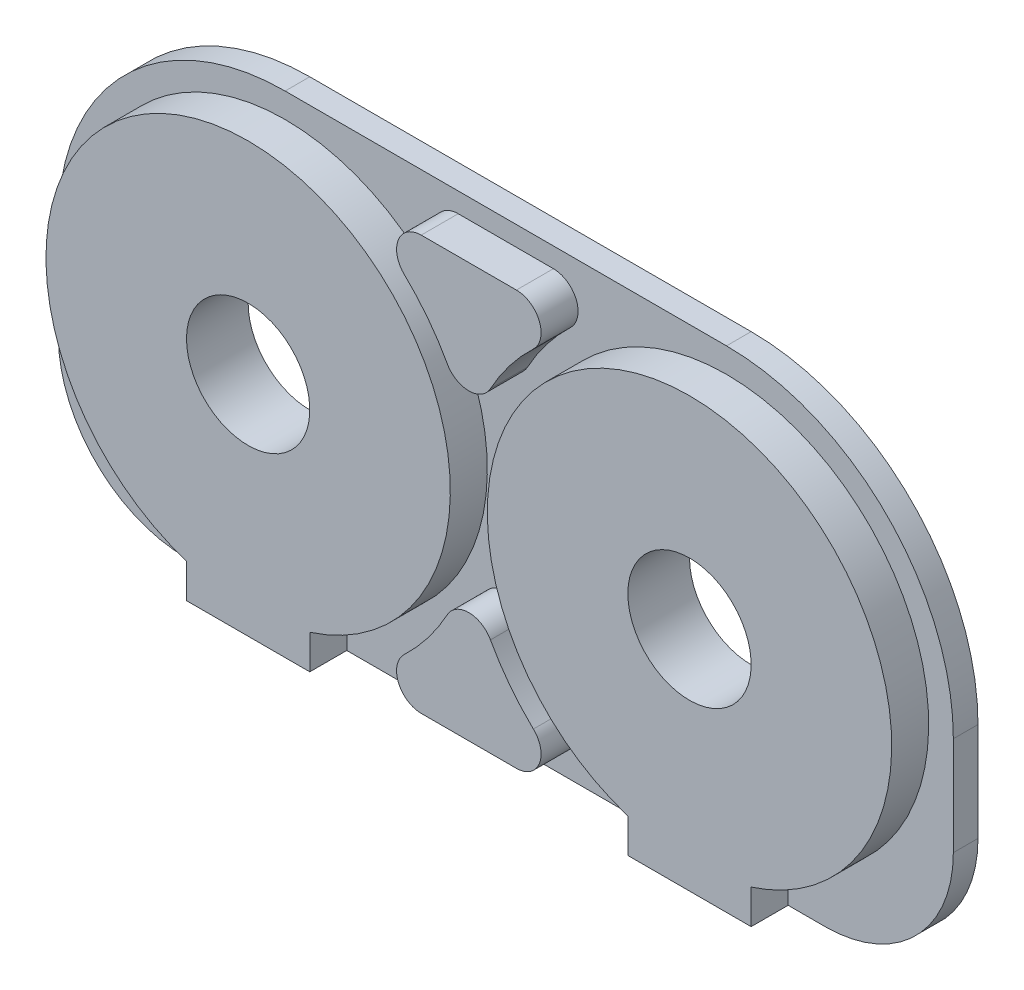
ISO-10303-21;
HEADER;
FILE_DESCRIPTION(('STEP AP214'),'2;1');
FILE_NAME('part.step','',(''),(''),'','','');
FILE_SCHEMA(('AUTOMOTIVE_DESIGN { 1 0 10303 214 1 1 1 1 }'));
ENDSEC;
DATA;
#1=APPLICATION_CONTEXT('core data for automotive mechanical design processes');
#2=APPLICATION_PROTOCOL_DEFINITION('international standard','automotive_design',2000,#1);
#3=PRODUCT_CONTEXT('',#1,'mechanical');
#4=PRODUCT('Part','Part','',(#3));
#5=PRODUCT_RELATED_PRODUCT_CATEGORY('part','',(#4));
#6=PRODUCT_DEFINITION_FORMATION('','',#4);
#7=PRODUCT_DEFINITION_CONTEXT('part definition',#1,'design');
#8=PRODUCT_DEFINITION('design','',#6,#7);
#9=PRODUCT_DEFINITION_SHAPE('','',#8);
#10=(LENGTH_UNIT() NAMED_UNIT(*) SI_UNIT(.MILLI.,.METRE.));
#11=(NAMED_UNIT(*) PLANE_ANGLE_UNIT() SI_UNIT($,.RADIAN.));
#12=(NAMED_UNIT(*) SI_UNIT($,.STERADIAN.) SOLID_ANGLE_UNIT());
#13=UNCERTAINTY_MEASURE_WITH_UNIT(LENGTH_MEASURE(1.E-05),#10,'distance_accuracy_value','');
#14=(GEOMETRIC_REPRESENTATION_CONTEXT(3) GLOBAL_UNCERTAINTY_ASSIGNED_CONTEXT((#13)) GLOBAL_UNIT_ASSIGNED_CONTEXT((#10,
#11,#12)) REPRESENTATION_CONTEXT('',''));
#15=CARTESIAN_POINT('',(0.,0.,0.));
#16=DIRECTION('',(0.,0.,1.));
#17=DIRECTION('',(1.,0.,0.));
#18=AXIS2_PLACEMENT_3D('',#15,#16,#17);
#19=CARTESIAN_POINT('',(8.95000000000006,0.,0.));
#20=DIRECTION('',(0.,0.,-1.));
#21=DIRECTION('',(-1.,0.,0.));
#22=AXIS2_PLACEMENT_3D('',#19,#20,#21);
#23=PLANE('',#22);
#24=CARTESIAN_POINT('',(-8.94999999999994,0.,0.));
#25=DIRECTION('',(0.,0.,-1.));
#26=DIRECTION('',(1.,0.,0.));
#27=AXIS2_PLACEMENT_3D('',#24,#25,#26);
#28=CIRCLE('',#27,9.2);
#29=CARTESIAN_POINT('',(-0.877450980392092,-4.41293012929374,0.));
#30=VERTEX_POINT('',#29);
#31=CARTESIAN_POINT('',(-2.61826099105817,-6.67450980392157,0.));
#32=VERTEX_POINT('',#31);
#33=EDGE_CURVE('E242',#30,#32,#28,.T.);
#34=ORIENTED_EDGE('',*,*,#33,.F.);
#35=CARTESIAN_POINT('',(0.,-4.89259644769523,0.));
#36=DIRECTION('',(0.,0.,1.));
#37=DIRECTION('',(1.,0.,0.));
#38=AXIS2_PLACEMENT_3D('',#35,#36,#37);
#39=CIRCLE('',#38,1.);
#40=CARTESIAN_POINT('',(0.877450980392217,-4.41293012929373,0.));
#41=VERTEX_POINT('',#40);
#42=EDGE_CURVE('E239',#41,#30,#39,.T.);
#43=ORIENTED_EDGE('',*,*,#42,.F.);
#44=CARTESIAN_POINT('',(8.95000000000006,0.,0.));
#45=DIRECTION('',(0.,0.,-1.));
#46=DIRECTION('',(1.,0.,0.));
#47=AXIS2_PLACEMENT_3D('',#44,#45,#46);
#48=CIRCLE('',#47,9.2);
#49=CARTESIAN_POINT('',(2.6182609910583,-6.67450980392157,0.));
#50=VERTEX_POINT('',#49);
#51=EDGE_CURVE('E910',#50,#41,#48,.T.);
#52=ORIENTED_EDGE('',*,*,#51,.F.);
#53=CARTESIAN_POINT('',(1.93002849008637,-7.4,0.));
#54=DIRECTION('',(0.,0.,1.));
#55=DIRECTION('',(1.,0.,0.));
#56=AXIS2_PLACEMENT_3D('',#53,#54,#55);
#57=CIRCLE('',#56,1.);
#58=CARTESIAN_POINT('',(1.93002849008637,-8.4,0.));
#59=VERTEX_POINT('',#58);
#60=EDGE_CURVE('E907',#59,#50,#57,.T.);
#61=ORIENTED_EDGE('',*,*,#60,.F.);
#62=DIRECTION('',(1.,0.,0.));
#63=VECTOR('',#62,1.);
#64=CARTESIAN_POINT('',(-1.93002849008624,-8.4,0.));
#65=LINE('',#64,#63);
#66=CARTESIAN_POINT('',(-1.93002849008624,-8.4,0.));
#67=VERTEX_POINT('',#66);
#68=EDGE_CURVE('E57',#67,#59,#65,.T.);
#69=ORIENTED_EDGE('',*,*,#68,.F.);
#70=CARTESIAN_POINT('',(-1.93002849008624,-7.4,0.));
#71=DIRECTION('',(0.,0.,1.));
#72=DIRECTION('',(1.,0.,0.));
#73=AXIS2_PLACEMENT_3D('',#70,#71,#72);
#74=CIRCLE('',#73,1.);
#75=EDGE_CURVE('E52',#32,#67,#74,.T.);
#76=ORIENTED_EDGE('',*,*,#75,.F.);
#77=EDGE_LOOP('',(#34,#43,#52,#61,#69,#76));
#78=FACE_BOUND('',#77,.T.);
#79=DIRECTION('',(0.,1.,0.));
#80=VECTOR('',#79,1.);
#81=CARTESIAN_POINT('',(-6.44999999999994,-8.01935159473632,0.));
#82=LINE('',#81,#80);
#83=CARTESIAN_POINT('',(-6.44999999999994,-9.2,0.));
#84=VERTEX_POINT('',#83);
#85=CARTESIAN_POINT('',(-6.44999999999994,-7.80960946526779,0.));
#86=VERTEX_POINT('',#85);
#87=EDGE_CURVE('E297',#84,#86,#82,.T.);
#88=ORIENTED_EDGE('',*,*,#87,.F.);
#89=DIRECTION('',(-1.,0.,0.));
#90=VECTOR('',#89,1.);
#91=CARTESIAN_POINT('',(-12.9499999999999,-9.2,0.));
#92=LINE('',#91,#90);
#93=CARTESIAN_POINT('',(6.45000000000006,-9.2,0.));
#94=VERTEX_POINT('',#93);
#95=EDGE_CURVE('E354',#94,#84,#92,.T.);
#96=ORIENTED_EDGE('',*,*,#95,.F.);
#97=DIRECTION('',(0.,-1.,0.));
#98=VECTOR('',#97,1.);
#99=CARTESIAN_POINT('',(6.45000000000006,-9.2,0.));
#100=LINE('',#99,#98);
#101=CARTESIAN_POINT('',(6.45000000000006,-7.80960946526776,0.));
#102=VERTEX_POINT('',#101);
#103=EDGE_CURVE('E398',#102,#94,#100,.T.);
#104=ORIENTED_EDGE('',*,*,#103,.F.);
#105=CARTESIAN_POINT('',(8.9500000000001,0.,0.));
#106=DIRECTION('',(0.,0.,1.));
#107=DIRECTION('',(1.,0.,0.));
#108=AXIS2_PLACEMENT_3D('',#105,#106,#107);
#109=CIRCLE('',#108,8.2);
#110=CARTESIAN_POINT('',(11.4500000000001,-7.80960946526779,0.));
#111=VERTEX_POINT('',#110);
#112=EDGE_CURVE('E384',#111,#102,#109,.T.);
#113=ORIENTED_EDGE('',*,*,#112,.F.);
#114=DIRECTION('',(0.,1.,0.));
#115=VECTOR('',#114,1.);
#116=CARTESIAN_POINT('',(11.4500000000001,-8.01935159473632,0.));
#117=LINE('',#116,#115);
#118=CARTESIAN_POINT('',(11.4500000000001,-9.2,0.));
#119=VERTEX_POINT('',#118);
#120=EDGE_CURVE('E389',#119,#111,#117,.T.);
#121=ORIENTED_EDGE('',*,*,#120,.F.);
#122=CARTESIAN_POINT('',(12.9500000000001,-9.2,0.));
#123=VERTEX_POINT('',#122);
#124=EDGE_CURVE('E350',#123,#119,#92,.T.);
#125=ORIENTED_EDGE('',*,*,#124,.F.);
#126=CARTESIAN_POINT('',(12.9500000000001,-4.,0.));
#127=DIRECTION('',(0.,0.,-1.));
#128=DIRECTION('',(-1.,0.,0.));
#129=AXIS2_PLACEMENT_3D('',#126,#127,#128);
#130=CIRCLE('',#129,5.2);
#131=CARTESIAN_POINT('',(18.1500000000001,-4.,0.));
#132=VERTEX_POINT('',#131);
#133=EDGE_CURVE('E346',#132,#123,#130,.T.);
#134=ORIENTED_EDGE('',*,*,#133,.F.);
#135=DIRECTION('',(0.,-1.,0.));
#136=VECTOR('',#135,1.);
#137=CARTESIAN_POINT('',(18.1500000000001,-4.,0.));
#138=LINE('',#137,#136);
#139=CARTESIAN_POINT('',(18.1500000000001,0.,0.));
#140=VERTEX_POINT('',#139);
#141=EDGE_CURVE('E344',#140,#132,#138,.T.);
#142=ORIENTED_EDGE('',*,*,#141,.F.);
#143=CARTESIAN_POINT('',(8.95000000000006,0.,0.));
#144=DIRECTION('',(0.,0.,-1.));
#145=DIRECTION('',(-1.,0.,0.));
#146=AXIS2_PLACEMENT_3D('',#143,#144,#145);
#147=CIRCLE('',#146,9.2);
#148=CARTESIAN_POINT('',(8.95000000000006,9.2,0.));
#149=VERTEX_POINT('',#148);
#150=EDGE_CURVE('E322',#149,#140,#147,.T.);
#151=ORIENTED_EDGE('',*,*,#150,.F.);
#152=DIRECTION('',(1.,0.,0.));
#153=VECTOR('',#152,1.);
#154=CARTESIAN_POINT('',(8.95000000000006,9.2,0.));
#155=LINE('',#154,#153);
#156=CARTESIAN_POINT('',(-8.94999999999994,9.2,0.));
#157=VERTEX_POINT('',#156);
#158=EDGE_CURVE('E327',#157,#149,#155,.T.);
#159=ORIENTED_EDGE('',*,*,#158,.F.);
#160=CARTESIAN_POINT('',(-8.94999999999994,0.,0.));
#161=DIRECTION('',(0.,0.,-1.));
#162=DIRECTION('',(-1.,0.,0.));
#163=AXIS2_PLACEMENT_3D('',#160,#161,#162);
#164=CIRCLE('',#163,9.2);
#165=CARTESIAN_POINT('',(-18.1499999999999,0.,0.));
#166=VERTEX_POINT('',#165);
#167=EDGE_CURVE('E358',#166,#157,#164,.T.);
#168=ORIENTED_EDGE('',*,*,#167,.F.);
#169=DIRECTION('',(0.,1.,0.));
#170=VECTOR('',#169,1.);
#171=CARTESIAN_POINT('',(-18.1499999999999,0.,0.));
#172=LINE('',#171,#170);
#173=CARTESIAN_POINT('',(-18.1499999999999,-4.,0.));
#174=VERTEX_POINT('',#173);
#175=EDGE_CURVE('E356',#174,#166,#172,.T.);
#176=ORIENTED_EDGE('',*,*,#175,.F.);
#177=CARTESIAN_POINT('',(-12.9499999999999,-4.,0.));
#178=DIRECTION('',(0.,0.,-1.));
#179=DIRECTION('',(-1.,0.,0.));
#180=AXIS2_PLACEMENT_3D('',#177,#178,#179);
#181=CIRCLE('',#180,5.2);
#182=CARTESIAN_POINT('',(-12.9499999999999,-9.2,0.));
#183=VERTEX_POINT('',#182);
#184=EDGE_CURVE('E353',#183,#174,#181,.T.);
#185=ORIENTED_EDGE('',*,*,#184,.F.);
#186=CARTESIAN_POINT('',(-11.4499999999999,-9.2,0.));
#187=VERTEX_POINT('',#186);
#188=EDGE_CURVE('E349',#187,#183,#92,.T.);
#189=ORIENTED_EDGE('',*,*,#188,.F.);
#190=DIRECTION('',(0.,-1.,0.));
#191=VECTOR('',#190,1.);
#192=CARTESIAN_POINT('',(-11.4499999999999,-9.2,0.));
#193=LINE('',#192,#191);
#194=CARTESIAN_POINT('',(-11.4499999999999,-7.80960946526776,0.));
#195=VERTEX_POINT('',#194);
#196=EDGE_CURVE('E301',#195,#187,#193,.T.);
#197=ORIENTED_EDGE('',*,*,#196,.F.);
#198=CARTESIAN_POINT('',(-8.9499999999999,0.,0.));
#199=DIRECTION('',(0.,0.,1.));
#200=DIRECTION('',(1.,0.,0.));
#201=AXIS2_PLACEMENT_3D('',#198,#199,#200);
#202=CIRCLE('',#201,8.2);
#203=EDGE_CURVE('E309',#86,#195,#202,.T.);
#204=ORIENTED_EDGE('',*,*,#203,.F.);
#205=EDGE_LOOP('',(#88,#96,#104,#113,#121,#125,#134,#142,#151,#159,#168,#176,#185,#189,#197,#204));
#206=FACE_BOUND('',#205,.T.);
#207=CARTESIAN_POINT('',(-1.93002849008624,7.4,0.));
#208=DIRECTION('',(0.,0.,1.));
#209=DIRECTION('',(1.,0.,0.));
#210=AXIS2_PLACEMENT_3D('',#207,#208,#209);
#211=CIRCLE('',#210,1.);
#212=CARTESIAN_POINT('',(-1.93002849008624,8.4,0.));
#213=VERTEX_POINT('',#212);
#214=CARTESIAN_POINT('',(-2.61826099105817,6.67450980392157,0.));
#215=VERTEX_POINT('',#214);
#216=EDGE_CURVE('E243',#213,#215,#211,.T.);
#217=ORIENTED_EDGE('',*,*,#216,.F.);
#218=DIRECTION('',(-1.,0.,0.));
#219=VECTOR('',#218,1.);
#220=CARTESIAN_POINT('',(1.93002849008637,8.4,0.));
#221=LINE('',#220,#219);
#222=CARTESIAN_POINT('',(1.93002849008637,8.4,0.));
#223=VERTEX_POINT('',#222);
#224=EDGE_CURVE('E256',#223,#213,#221,.T.);
#225=ORIENTED_EDGE('',*,*,#224,.F.);
#226=CARTESIAN_POINT('',(1.93002849008637,7.4,0.));
#227=DIRECTION('',(0.,0.,1.));
#228=DIRECTION('',(1.,0.,0.));
#229=AXIS2_PLACEMENT_3D('',#226,#227,#228);
#230=CIRCLE('',#229,1.);
#231=CARTESIAN_POINT('',(2.6182609910583,6.67450980392157,0.));
#232=VERTEX_POINT('',#231);
#233=EDGE_CURVE('E275',#232,#223,#230,.T.);
#234=ORIENTED_EDGE('',*,*,#233,.F.);
#235=CARTESIAN_POINT('',(8.95000000000006,0.,0.));
#236=DIRECTION('',(0.,0.,-1.));
#237=DIRECTION('',(1.,0.,0.));
#238=AXIS2_PLACEMENT_3D('',#235,#236,#237);
#239=CIRCLE('',#238,9.2);
#240=CARTESIAN_POINT('',(0.877450980392222,4.41293012929374,0.));
#241=VERTEX_POINT('',#240);
#242=EDGE_CURVE('E272',#241,#232,#239,.T.);
#243=ORIENTED_EDGE('',*,*,#242,.F.);
#244=CARTESIAN_POINT('',(0.,4.89259644769523,0.));
#245=DIRECTION('',(0.,0.,1.));
#246=DIRECTION('',(1.,0.,0.));
#247=AXIS2_PLACEMENT_3D('',#244,#245,#246);
#248=CIRCLE('',#247,1.);
#249=CARTESIAN_POINT('',(-0.877450980392092,4.41293012929374,0.));
#250=VERTEX_POINT('',#249);
#251=EDGE_CURVE('E269',#250,#241,#248,.T.);
#252=ORIENTED_EDGE('',*,*,#251,.F.);
#253=CARTESIAN_POINT('',(-8.94999999999994,0.,0.));
#254=DIRECTION('',(0.,0.,-1.));
#255=DIRECTION('',(1.,0.,0.));
#256=AXIS2_PLACEMENT_3D('',#253,#254,#255);
#257=CIRCLE('',#256,9.2);
#258=EDGE_CURVE('E246',#215,#250,#257,.T.);
#259=ORIENTED_EDGE('',*,*,#258,.F.);
#260=EDGE_LOOP('',(#217,#225,#234,#243,#252,#259));
#261=FACE_BOUND('',#260,.T.);
#262=ADVANCED_FACE('F37',(#78,#206,#261),#23,.F.);
#263=CARTESIAN_POINT('',(8.9500000000001,0.,1.5));
#264=DIRECTION('',(0.,0.,-1.));
#265=DIRECTION('',(-1.,0.,0.));
#266=AXIS2_PLACEMENT_3D('',#263,#264,#265);
#267=CYLINDRICAL_SURFACE('',#266,8.2);
#268=ORIENTED_EDGE('',*,*,#112,.T.);
#269=DIRECTION('',(0.,0.,-1.));
#270=VECTOR('',#269,1.);
#271=CARTESIAN_POINT('',(6.45000000000006,-7.80960946526776,1.5));
#272=LINE('',#271,#270);
#273=CARTESIAN_POINT('',(6.45000000000006,-7.80960946526776,1.5));
#274=VERTEX_POINT('',#273);
#275=EDGE_CURVE('E11',#274,#102,#272,.T.);
#276=ORIENTED_EDGE('',*,*,#275,.F.);
#277=CARTESIAN_POINT('',(8.9500000000001,0.,1.5));
#278=DIRECTION('',(0.,0.,1.));
#279=DIRECTION('',(1.,0.,0.));
#280=AXIS2_PLACEMENT_3D('',#277,#278,#279);
#281=CIRCLE('',#280,8.2);
#282=CARTESIAN_POINT('',(11.4500000000001,-7.80960946526779,1.5));
#283=VERTEX_POINT('',#282);
#284=EDGE_CURVE('E385',#283,#274,#281,.T.);
#285=ORIENTED_EDGE('',*,*,#284,.F.);
#286=DIRECTION('',(0.,0.,-1.));
#287=VECTOR('',#286,1.);
#288=CARTESIAN_POINT('',(11.4500000000001,-7.80960946526779,1.5));
#289=LINE('',#288,#287);
#290=EDGE_CURVE('E395',#283,#111,#289,.T.);
#291=ORIENTED_EDGE('',*,*,#290,.T.);
#292=EDGE_LOOP('',(#268,#276,#285,#291));
#293=FACE_BOUND('',#292,.T.);
#294=ADVANCED_FACE('F39',(#293),#267,.T.);
#295=CARTESIAN_POINT('',(6.45000000000006,-9.2,1.5));
#296=DIRECTION('',(1.,0.,0.));
#297=DIRECTION('',(0.,0.,-1.));
#298=AXIS2_PLACEMENT_3D('',#295,#296,#297);
#299=PLANE('',#298);
#300=ORIENTED_EDGE('',*,*,#103,.T.);
#301=DIRECTION('',(0.,0.,-1.));
#302=VECTOR('',#301,1.);
#303=CARTESIAN_POINT('',(6.45000000000006,-9.2,1.5));
#304=LINE('',#303,#302);
#305=CARTESIAN_POINT('',(6.45000000000006,-9.2,1.5));
#306=VERTEX_POINT('',#305);
#307=EDGE_CURVE('E45',#306,#94,#304,.T.);
#308=ORIENTED_EDGE('',*,*,#307,.F.);
#309=DIRECTION('',(0.,-1.,0.));
#310=VECTOR('',#309,1.);
#311=CARTESIAN_POINT('',(6.45000000000006,-8.01935159473632,1.5));
#312=LINE('',#311,#310);
#313=EDGE_CURVE('E388',#274,#306,#312,.T.);
#314=ORIENTED_EDGE('',*,*,#313,.F.);
#315=ORIENTED_EDGE('',*,*,#275,.T.);
#316=EDGE_LOOP('',(#300,#308,#314,#315));
#317=FACE_BOUND('',#316,.T.);
#318=ADVANCED_FACE('F416',(#317),#299,.F.);
#319=CARTESIAN_POINT('',(11.4500000000001,-9.2,1.5));
#320=DIRECTION('',(0.,1.,0.));
#321=DIRECTION('',(0.,0.,1.));
#322=AXIS2_PLACEMENT_3D('',#319,#320,#321);
#323=PLANE('',#322);
#324=ORIENTED_EDGE('',*,*,#307,.T.);
#325=ORIENTED_EDGE('',*,*,#95,.T.);
#326=DIRECTION('',(0.,0.,-1.));
#327=VECTOR('',#326,1.);
#328=CARTESIAN_POINT('',(-6.44999999999994,-9.2,1.5));
#329=LINE('',#328,#327);
#330=CARTESIAN_POINT('',(-6.44999999999994,-9.2,1.5));
#331=VERTEX_POINT('',#330);
#332=EDGE_CURVE('E307',#331,#84,#329,.T.);
#333=ORIENTED_EDGE('',*,*,#332,.F.);
#334=DIRECTION('',(1.,0.,0.));
#335=VECTOR('',#334,1.);
#336=CARTESIAN_POINT('',(-6.44999999999994,-9.2,1.5));
#337=LINE('',#336,#335);
#338=CARTESIAN_POINT('',(-11.4499999999999,-9.2,1.5));
#339=VERTEX_POINT('',#338);
#340=EDGE_CURVE('E305',#339,#331,#337,.T.);
#341=ORIENTED_EDGE('',*,*,#340,.F.);
#342=DIRECTION('',(0.,0.,-1.));
#343=VECTOR('',#342,1.);
#344=CARTESIAN_POINT('',(-11.4499999999999,-9.2,1.5));
#345=LINE('',#344,#343);
#346=EDGE_CURVE('E314',#339,#187,#345,.T.);
#347=ORIENTED_EDGE('',*,*,#346,.T.);
#348=ORIENTED_EDGE('',*,*,#188,.T.);
#349=DIRECTION('',(0.,0.,1.));
#350=VECTOR('',#349,1.);
#351=CARTESIAN_POINT('',(-12.9499999999999,-9.2,-1.));
#352=LINE('',#351,#350);
#353=CARTESIAN_POINT('',(-12.9499999999999,-9.2,-1.));
#354=VERTEX_POINT('',#353);
#355=EDGE_CURVE('E372',#354,#183,#352,.T.);
#356=ORIENTED_EDGE('',*,*,#355,.F.);
#357=DIRECTION('',(-1.,0.,0.));
#358=VECTOR('',#357,1.);
#359=CARTESIAN_POINT('',(11.4500000000001,-9.2,-1.));
#360=LINE('',#359,#358);
#361=CARTESIAN_POINT('',(12.9500000000001,-9.2,-1.));
#362=VERTEX_POINT('',#361);
#363=EDGE_CURVE('E331',#362,#354,#360,.T.);
#364=ORIENTED_EDGE('',*,*,#363,.F.);
#365=DIRECTION('',(0.,0.,1.));
#366=VECTOR('',#365,1.);
#367=CARTESIAN_POINT('',(12.9500000000001,-9.2,-1.));
#368=LINE('',#367,#366);
#369=EDGE_CURVE('E375',#362,#123,#368,.T.);
#370=ORIENTED_EDGE('',*,*,#369,.T.);
#371=ORIENTED_EDGE('',*,*,#124,.T.);
#372=DIRECTION('',(0.,0.,-1.));
#373=VECTOR('',#372,1.);
#374=CARTESIAN_POINT('',(11.4500000000001,-9.2,1.5));
#375=LINE('',#374,#373);
#376=CARTESIAN_POINT('',(11.4500000000001,-9.2,1.5));
#377=VERTEX_POINT('',#376);
#378=EDGE_CURVE('E405',#377,#119,#375,.T.);
#379=ORIENTED_EDGE('',*,*,#378,.F.);
#380=DIRECTION('',(1.,0.,0.));
#381=VECTOR('',#380,1.);
#382=CARTESIAN_POINT('',(11.4500000000001,-9.2,1.5));
#383=LINE('',#382,#381);
#384=EDGE_CURVE('E391',#306,#377,#383,.T.);
#385=ORIENTED_EDGE('',*,*,#384,.F.);
#386=EDGE_LOOP('',(#324,#325,#333,#341,#347,#348,#356,#364,#370,#371,#379,#385));
#387=FACE_BOUND('',#386,.T.);
#388=ADVANCED_FACE('F412',(#387),#323,.F.);
#389=CARTESIAN_POINT('',(11.4500000000001,-8.01935159473632,1.5));
#390=DIRECTION('',(-1.,0.,0.));
#391=DIRECTION('',(0.,0.,1.));
#392=AXIS2_PLACEMENT_3D('',#389,#390,#391);
#393=PLANE('',#392);
#394=ORIENTED_EDGE('',*,*,#120,.T.);
#395=ORIENTED_EDGE('',*,*,#290,.F.);
#396=DIRECTION('',(0.,1.,0.));
#397=VECTOR('',#396,1.);
#398=CARTESIAN_POINT('',(11.4500000000001,-8.01935159473632,1.5));
#399=LINE('',#398,#397);
#400=EDGE_CURVE('E393',#377,#283,#399,.T.);
#401=ORIENTED_EDGE('',*,*,#400,.F.);
#402=ORIENTED_EDGE('',*,*,#378,.T.);
#403=EDGE_LOOP('',(#394,#395,#401,#402));
#404=FACE_BOUND('',#403,.T.);
#405=ADVANCED_FACE('F457',(#404),#393,.F.);
#406=CARTESIAN_POINT('',(8.9500000000001,0.,1.5));
#407=DIRECTION('',(0.,0.,1.));
#408=DIRECTION('',(1.,0.,0.));
#409=AXIS2_PLACEMENT_3D('',#406,#407,#408);
#410=PLANE('',#409);
#411=CARTESIAN_POINT('',(8.94999999999993,0.,1.5));
#412=DIRECTION('',(0.,0.,-1.));
#413=DIRECTION('',(-1.,0.,0.));
#414=AXIS2_PLACEMENT_3D('',#411,#412,#413);
#415=CIRCLE('',#414,2.5);
#416=CARTESIAN_POINT('',(6.44999999999993,0.,1.5));
#417=VERTEX_POINT('',#416);
#418=EDGE_CURVE('E884',#417,#417,#415,.T.);
#419=ORIENTED_EDGE('',*,*,#418,.T.);
#420=EDGE_LOOP('',(#419));
#421=FACE_BOUND('',#420,.T.);
#422=ORIENTED_EDGE('',*,*,#284,.T.);
#423=ORIENTED_EDGE('',*,*,#313,.T.);
#424=ORIENTED_EDGE('',*,*,#384,.T.);
#425=ORIENTED_EDGE('',*,*,#400,.T.);
#426=EDGE_LOOP('',(#422,#423,#424,#425));
#427=FACE_BOUND('',#426,.T.);
#428=ADVANCED_FACE('F462',(#421,#427),#410,.T.);
#429=CARTESIAN_POINT('',(8.95000000000006,0.,-1.));
#430=DIRECTION('',(0.,0.,1.));
#431=DIRECTION('',(1.,0.,0.));
#432=AXIS2_PLACEMENT_3D('',#429,#430,#431);
#433=CYLINDRICAL_SURFACE('',#432,9.2);
#434=ORIENTED_EDGE('',*,*,#150,.T.);
#435=DIRECTION('',(0.,0.,1.));
#436=VECTOR('',#435,1.);
#437=CARTESIAN_POINT('',(18.1500000000001,0.,-1.));
#438=LINE('',#437,#436);
#439=CARTESIAN_POINT('',(18.1500000000001,0.,-1.));
#440=VERTEX_POINT('',#439);
#441=EDGE_CURVE('E381',#440,#140,#438,.T.);
#442=ORIENTED_EDGE('',*,*,#441,.F.);
#443=CARTESIAN_POINT('',(8.95000000000006,0.,-1.));
#444=DIRECTION('',(0.,0.,-1.));
#445=DIRECTION('',(-1.,0.,0.));
#446=AXIS2_PLACEMENT_3D('',#443,#444,#445);
#447=CIRCLE('',#446,9.2);
#448=CARTESIAN_POINT('',(8.95000000000006,9.2,-1.));
#449=VERTEX_POINT('',#448);
#450=EDGE_CURVE('E323',#449,#440,#447,.T.);
#451=ORIENTED_EDGE('',*,*,#450,.F.);
#452=DIRECTION('',(0.,0.,1.));
#453=VECTOR('',#452,1.);
#454=CARTESIAN_POINT('',(8.95000000000006,9.2,-1.));
#455=LINE('',#454,#453);
#456=EDGE_CURVE('E341',#449,#149,#455,.T.);
#457=ORIENTED_EDGE('',*,*,#456,.T.);
#458=EDGE_LOOP('',(#434,#442,#451,#457));
#459=FACE_BOUND('',#458,.T.);
#460=ADVANCED_FACE('F464',(#459),#433,.T.);
#461=CARTESIAN_POINT('',(18.1500000000001,-4.,-1.));
#462=DIRECTION('',(-1.,0.,0.));
#463=DIRECTION('',(0.,0.,1.));
#464=AXIS2_PLACEMENT_3D('',#461,#462,#463);
#465=PLANE('',#464);
#466=ORIENTED_EDGE('',*,*,#141,.T.);
#467=DIRECTION('',(0.,0.,1.));
#468=VECTOR('',#467,1.);
#469=CARTESIAN_POINT('',(18.1500000000001,-4.,-1.));
#470=LINE('',#469,#468);
#471=CARTESIAN_POINT('',(18.1500000000001,-4.,-1.));
#472=VERTEX_POINT('',#471);
#473=EDGE_CURVE('E378',#472,#132,#470,.T.);
#474=ORIENTED_EDGE('',*,*,#473,.F.);
#475=DIRECTION('',(0.,-1.,0.));
#476=VECTOR('',#475,1.);
#477=CARTESIAN_POINT('',(18.1500000000001,-4.,-1.));
#478=LINE('',#477,#476);
#479=EDGE_CURVE('E326',#440,#472,#478,.T.);
#480=ORIENTED_EDGE('',*,*,#479,.F.);
#481=ORIENTED_EDGE('',*,*,#441,.T.);
#482=EDGE_LOOP('',(#466,#474,#480,#481));
#483=FACE_BOUND('',#482,.T.);
#484=ADVANCED_FACE('F471',(#483),#465,.F.);
#485=CARTESIAN_POINT('',(12.9500000000001,-4.,-1.));
#486=DIRECTION('',(0.,0.,1.));
#487=DIRECTION('',(1.,0.,0.));
#488=AXIS2_PLACEMENT_3D('',#485,#486,#487);
#489=CYLINDRICAL_SURFACE('',#488,5.2);
#490=ORIENTED_EDGE('',*,*,#133,.T.);
#491=ORIENTED_EDGE('',*,*,#369,.F.);
#492=CARTESIAN_POINT('',(12.9500000000001,-4.,-1.));
#493=DIRECTION('',(0.,0.,-1.));
#494=DIRECTION('',(-1.,0.,0.));
#495=AXIS2_PLACEMENT_3D('',#492,#493,#494);
#496=CIRCLE('',#495,5.2);
#497=EDGE_CURVE('E329',#472,#362,#496,.T.);
#498=ORIENTED_EDGE('',*,*,#497,.F.);
#499=ORIENTED_EDGE('',*,*,#473,.T.);
#500=EDGE_LOOP('',(#490,#491,#498,#499));
#501=FACE_BOUND('',#500,.T.);
#502=ADVANCED_FACE('F451',(#501),#489,.T.);
#503=CARTESIAN_POINT('',(-12.9499999999999,-4.,-1.));
#504=DIRECTION('',(0.,0.,1.));
#505=DIRECTION('',(1.,0.,0.));
#506=AXIS2_PLACEMENT_3D('',#503,#504,#505);
#507=CYLINDRICAL_SURFACE('',#506,5.2);
#508=ORIENTED_EDGE('',*,*,#184,.T.);
#509=DIRECTION('',(0.,0.,1.));
#510=VECTOR('',#509,1.);
#511=CARTESIAN_POINT('',(-18.1499999999999,-4.,-1.));
#512=LINE('',#511,#510);
#513=CARTESIAN_POINT('',(-18.1499999999999,-4.,-1.));
#514=VERTEX_POINT('',#513);
#515=EDGE_CURVE('E369',#514,#174,#512,.T.);
#516=ORIENTED_EDGE('',*,*,#515,.F.);
#517=CARTESIAN_POINT('',(-12.9499999999999,-4.,-1.));
#518=DIRECTION('',(0.,0.,-1.));
#519=DIRECTION('',(-1.,0.,0.));
#520=AXIS2_PLACEMENT_3D('',#517,#518,#519);
#521=CIRCLE('',#520,5.2);
#522=EDGE_CURVE('E333',#354,#514,#521,.T.);
#523=ORIENTED_EDGE('',*,*,#522,.F.);
#524=ORIENTED_EDGE('',*,*,#355,.T.);
#525=EDGE_LOOP('',(#508,#516,#523,#524));
#526=FACE_BOUND('',#525,.T.);
#527=ADVANCED_FACE('F431',(#526),#507,.T.);
#528=CARTESIAN_POINT('',(-18.1499999999999,0.,-1.));
#529=DIRECTION('',(1.,0.,0.));
#530=DIRECTION('',(0.,1.,0.));
#531=AXIS2_PLACEMENT_3D('',#528,#529,#530);
#532=PLANE('',#531);
#533=ORIENTED_EDGE('',*,*,#175,.T.);
#534=DIRECTION('',(0.,0.,1.));
#535=VECTOR('',#534,1.);
#536=CARTESIAN_POINT('',(-18.1499999999999,0.,-1.));
#537=LINE('',#536,#535);
#538=CARTESIAN_POINT('',(-18.1499999999999,0.,-1.));
#539=VERTEX_POINT('',#538);
#540=EDGE_CURVE('E366',#539,#166,#537,.T.);
#541=ORIENTED_EDGE('',*,*,#540,.F.);
#542=DIRECTION('',(0.,1.,0.));
#543=VECTOR('',#542,1.);
#544=CARTESIAN_POINT('',(-18.1499999999999,0.,-1.));
#545=LINE('',#544,#543);
#546=EDGE_CURVE('E335',#514,#539,#545,.T.);
#547=ORIENTED_EDGE('',*,*,#546,.F.);
#548=ORIENTED_EDGE('',*,*,#515,.T.);
#549=EDGE_LOOP('',(#533,#541,#547,#548));
#550=FACE_BOUND('',#549,.T.);
#551=ADVANCED_FACE('F438',(#550),#532,.F.);
#552=CARTESIAN_POINT('',(-8.94999999999994,0.,-1.));
#553=DIRECTION('',(0.,0.,1.));
#554=DIRECTION('',(1.,0.,0.));
#555=AXIS2_PLACEMENT_3D('',#552,#553,#554);
#556=CYLINDRICAL_SURFACE('',#555,9.2);
#557=ORIENTED_EDGE('',*,*,#167,.T.);
#558=DIRECTION('',(0.,0.,1.));
#559=VECTOR('',#558,1.);
#560=CARTESIAN_POINT('',(-8.94999999999994,9.2,-1.));
#561=LINE('',#560,#559);
#562=CARTESIAN_POINT('',(-8.94999999999994,9.2,-1.));
#563=VERTEX_POINT('',#562);
#564=EDGE_CURVE('E363',#563,#157,#561,.T.);
#565=ORIENTED_EDGE('',*,*,#564,.F.);
#566=CARTESIAN_POINT('',(-8.94999999999994,0.,-1.));
#567=DIRECTION('',(0.,0.,-1.));
#568=DIRECTION('',(-1.,0.,0.));
#569=AXIS2_PLACEMENT_3D('',#566,#567,#568);
#570=CIRCLE('',#569,9.2);
#571=EDGE_CURVE('E337',#539,#563,#570,.T.);
#572=ORIENTED_EDGE('',*,*,#571,.F.);
#573=ORIENTED_EDGE('',*,*,#540,.T.);
#574=EDGE_LOOP('',(#557,#565,#572,#573));
#575=FACE_BOUND('',#574,.T.);
#576=ADVANCED_FACE('F442',(#575),#556,.T.);
#577=CARTESIAN_POINT('',(8.95000000000006,9.2,-1.));
#578=DIRECTION('',(0.,-1.,0.));
#579=DIRECTION('',(0.,0.,-1.));
#580=AXIS2_PLACEMENT_3D('',#577,#578,#579);
#581=PLANE('',#580);
#582=ORIENTED_EDGE('',*,*,#158,.T.);
#583=ORIENTED_EDGE('',*,*,#456,.F.);
#584=DIRECTION('',(1.,0.,0.));
#585=VECTOR('',#584,1.);
#586=CARTESIAN_POINT('',(8.95000000000006,9.2,-1.));
#587=LINE('',#586,#585);
#588=EDGE_CURVE('E339',#563,#449,#587,.T.);
#589=ORIENTED_EDGE('',*,*,#588,.F.);
#590=ORIENTED_EDGE('',*,*,#564,.T.);
#591=EDGE_LOOP('',(#582,#583,#589,#590));
#592=FACE_BOUND('',#591,.T.);
#593=ADVANCED_FACE('F484',(#592),#581,.F.);
#594=CARTESIAN_POINT('',(8.95000000000006,0.,-1.));
#595=DIRECTION('',(0.,0.,-1.));
#596=DIRECTION('',(-1.,0.,0.));
#597=AXIS2_PLACEMENT_3D('',#594,#595,#596);
#598=PLANE('',#597);
#599=CARTESIAN_POINT('',(8.94999999999993,0.,-1.));
#600=DIRECTION('',(0.,0.,-1.));
#601=DIRECTION('',(-1.,0.,0.));
#602=AXIS2_PLACEMENT_3D('',#599,#600,#601);
#603=CIRCLE('',#602,2.5);
#604=CARTESIAN_POINT('',(6.44999999999993,0.,-1.));
#605=VERTEX_POINT('',#604);
#606=EDGE_CURVE('E887',#605,#605,#603,.T.);
#607=ORIENTED_EDGE('',*,*,#606,.F.);
#608=EDGE_LOOP('',(#607));
#609=FACE_BOUND('',#608,.T.);
#610=CARTESIAN_POINT('',(-8.95000000000007,0.,-1.));
#611=DIRECTION('',(0.,0.,-1.));
#612=DIRECTION('',(-1.,0.,0.));
#613=AXIS2_PLACEMENT_3D('',#610,#611,#612);
#614=CIRCLE('',#613,2.5);
#615=CARTESIAN_POINT('',(-11.4500000000001,0.,-1.));
#616=VERTEX_POINT('',#615);
#617=EDGE_CURVE('E892',#616,#616,#614,.T.);
#618=ORIENTED_EDGE('',*,*,#617,.F.);
#619=EDGE_LOOP('',(#618));
#620=FACE_BOUND('',#619,.T.);
#621=ORIENTED_EDGE('',*,*,#450,.T.);
#622=ORIENTED_EDGE('',*,*,#479,.T.);
#623=ORIENTED_EDGE('',*,*,#497,.T.);
#624=ORIENTED_EDGE('',*,*,#363,.T.);
#625=ORIENTED_EDGE('',*,*,#522,.T.);
#626=ORIENTED_EDGE('',*,*,#546,.T.);
#627=ORIENTED_EDGE('',*,*,#571,.T.);
#628=ORIENTED_EDGE('',*,*,#588,.T.);
#629=EDGE_LOOP('',(#621,#622,#623,#624,#625,#626,#627,#628));
#630=FACE_BOUND('',#629,.T.);
#631=ADVANCED_FACE('F446',(#609,#620,#630),#598,.T.);
#632=CARTESIAN_POINT('',(-6.44999999999994,-8.01935159473632,1.5));
#633=DIRECTION('',(-1.,0.,0.));
#634=DIRECTION('',(0.,0.,1.));
#635=AXIS2_PLACEMENT_3D('',#632,#633,#634);
#636=PLANE('',#635);
#637=ORIENTED_EDGE('',*,*,#87,.T.);
#638=DIRECTION('',(0.,0.,-1.));
#639=VECTOR('',#638,1.);
#640=CARTESIAN_POINT('',(-6.44999999999994,-7.80960946526779,1.5));
#641=LINE('',#640,#639);
#642=CARTESIAN_POINT('',(-6.44999999999994,-7.80960946526779,1.5));
#643=VERTEX_POINT('',#642);
#644=EDGE_CURVE('E319',#643,#86,#641,.T.);
#645=ORIENTED_EDGE('',*,*,#644,.F.);
#646=DIRECTION('',(0.,1.,0.));
#647=VECTOR('',#646,1.);
#648=CARTESIAN_POINT('',(-6.44999999999994,-8.01935159473632,1.5));
#649=LINE('',#648,#647);
#650=EDGE_CURVE('E298',#331,#643,#649,.T.);
#651=ORIENTED_EDGE('',*,*,#650,.F.);
#652=ORIENTED_EDGE('',*,*,#332,.T.);
#653=EDGE_LOOP('',(#637,#645,#651,#652));
#654=FACE_BOUND('',#653,.T.);
#655=ADVANCED_FACE('F531',(#654),#636,.F.);
#656=CARTESIAN_POINT('',(-8.9499999999999,0.,1.5));
#657=DIRECTION('',(0.,0.,-1.));
#658=DIRECTION('',(-1.,0.,0.));
#659=AXIS2_PLACEMENT_3D('',#656,#657,#658);
#660=CYLINDRICAL_SURFACE('',#659,8.2);
#661=ORIENTED_EDGE('',*,*,#203,.T.);
#662=DIRECTION('',(0.,0.,-1.));
#663=VECTOR('',#662,1.);
#664=CARTESIAN_POINT('',(-11.4499999999999,-7.80960946526776,1.5));
#665=LINE('',#664,#663);
#666=CARTESIAN_POINT('',(-11.4499999999999,-7.80960946526776,1.5));
#667=VERTEX_POINT('',#666);
#668=EDGE_CURVE('E316',#667,#195,#665,.T.);
#669=ORIENTED_EDGE('',*,*,#668,.F.);
#670=CARTESIAN_POINT('',(-8.9499999999999,0.,1.5));
#671=DIRECTION('',(0.,0.,1.));
#672=DIRECTION('',(1.,0.,0.));
#673=AXIS2_PLACEMENT_3D('',#670,#671,#672);
#674=CIRCLE('',#673,8.2);
#675=EDGE_CURVE('E300',#643,#667,#674,.T.);
#676=ORIENTED_EDGE('',*,*,#675,.F.);
#677=ORIENTED_EDGE('',*,*,#644,.T.);
#678=EDGE_LOOP('',(#661,#669,#676,#677));
#679=FACE_BOUND('',#678,.T.);
#680=ADVANCED_FACE('F538',(#679),#660,.T.);
#681=CARTESIAN_POINT('',(-11.4499999999999,-9.2,1.5));
#682=DIRECTION('',(1.,0.,0.));
#683=DIRECTION('',(0.,0.,-1.));
#684=AXIS2_PLACEMENT_3D('',#681,#682,#683);
#685=PLANE('',#684);
#686=ORIENTED_EDGE('',*,*,#196,.T.);
#687=ORIENTED_EDGE('',*,*,#346,.F.);
#688=DIRECTION('',(0.,-1.,0.));
#689=VECTOR('',#688,1.);
#690=CARTESIAN_POINT('',(-11.4499999999999,-8.01935159473632,1.5));
#691=LINE('',#690,#689);
#692=EDGE_CURVE('E303',#667,#339,#691,.T.);
#693=ORIENTED_EDGE('',*,*,#692,.F.);
#694=ORIENTED_EDGE('',*,*,#668,.T.);
#695=EDGE_LOOP('',(#686,#687,#693,#694));
#696=FACE_BOUND('',#695,.T.);
#697=ADVANCED_FACE('F545',(#696),#685,.F.);
#698=CARTESIAN_POINT('',(-8.9499999999999,0.,1.5));
#699=DIRECTION('',(0.,0.,1.));
#700=DIRECTION('',(1.,0.,0.));
#701=AXIS2_PLACEMENT_3D('',#698,#699,#700);
#702=PLANE('',#701);
#703=CARTESIAN_POINT('',(-8.95000000000007,0.,1.5));
#704=DIRECTION('',(0.,0.,-1.));
#705=DIRECTION('',(-1.,0.,0.));
#706=AXIS2_PLACEMENT_3D('',#703,#704,#705);
#707=CIRCLE('',#706,2.5);
#708=CARTESIAN_POINT('',(-11.4500000000001,0.,1.5));
#709=VERTEX_POINT('',#708);
#710=EDGE_CURVE('E888',#709,#709,#707,.T.);
#711=ORIENTED_EDGE('',*,*,#710,.T.);
#712=EDGE_LOOP('',(#711));
#713=FACE_BOUND('',#712,.T.);
#714=ORIENTED_EDGE('',*,*,#650,.T.);
#715=ORIENTED_EDGE('',*,*,#675,.T.);
#716=ORIENTED_EDGE('',*,*,#692,.T.);
#717=ORIENTED_EDGE('',*,*,#340,.T.);
#718=EDGE_LOOP('',(#714,#715,#716,#717));
#719=FACE_BOUND('',#718,.T.);
#720=ADVANCED_FACE('F553',(#713,#719),#702,.T.);
#721=CARTESIAN_POINT('',(-1.93002849008624,7.4,1.5));
#722=DIRECTION('',(0.,0.,-1.));
#723=DIRECTION('',(-1.,0.,0.));
#724=AXIS2_PLACEMENT_3D('',#721,#722,#723);
#725=CYLINDRICAL_SURFACE('',#724,1.);
#726=ORIENTED_EDGE('',*,*,#216,.T.);
#727=DIRECTION('',(0.,0.,-1.));
#728=VECTOR('',#727,1.);
#729=CARTESIAN_POINT('',(-2.61826099105817,6.67450980392157,1.5));
#730=LINE('',#729,#728);
#731=CARTESIAN_POINT('',(-2.61826099105817,6.67450980392157,1.5));
#732=VERTEX_POINT('',#731);
#733=EDGE_CURVE('E294',#732,#215,#730,.T.);
#734=ORIENTED_EDGE('',*,*,#733,.F.);
#735=CARTESIAN_POINT('',(-1.93002849008624,7.4,1.5));
#736=DIRECTION('',(0.,0.,1.));
#737=DIRECTION('',(1.,0.,0.));
#738=AXIS2_PLACEMENT_3D('',#735,#736,#737);
#739=CIRCLE('',#738,1.);
#740=CARTESIAN_POINT('',(-1.93002849008624,8.4,1.5));
#741=VERTEX_POINT('',#740);
#742=EDGE_CURVE('E252',#741,#732,#739,.T.);
#743=ORIENTED_EDGE('',*,*,#742,.F.);
#744=DIRECTION('',(0.,0.,-1.));
#745=VECTOR('',#744,1.);
#746=CARTESIAN_POINT('',(-1.93002849008624,8.4,1.5));
#747=LINE('',#746,#745);
#748=EDGE_CURVE('E265',#741,#213,#747,.T.);
#749=ORIENTED_EDGE('',*,*,#748,.T.);
#750=EDGE_LOOP('',(#726,#734,#743,#749));
#751=FACE_BOUND('',#750,.T.);
#752=ADVANCED_FACE('F561',(#751),#725,.T.);
#753=CARTESIAN_POINT('',(-8.94999999999994,0.,1.5));
#754=DIRECTION('',(0.,0.,-1.));
#755=DIRECTION('',(-1.,0.,0.));
#756=AXIS2_PLACEMENT_3D('',#753,#754,#755);
#757=CYLINDRICAL_SURFACE('',#756,9.2);
#758=ORIENTED_EDGE('',*,*,#258,.T.);
#759=DIRECTION('',(0.,0.,-1.));
#760=VECTOR('',#759,1.);
#761=CARTESIAN_POINT('',(-0.877450980392092,4.41293012929374,1.5));
#762=LINE('',#761,#760);
#763=CARTESIAN_POINT('',(-0.877450980392092,4.41293012929374,1.5));
#764=VERTEX_POINT('',#763);
#765=EDGE_CURVE('E291',#764,#250,#762,.T.);
#766=ORIENTED_EDGE('',*,*,#765,.F.);
#767=CARTESIAN_POINT('',(-8.94999999999994,0.,1.5));
#768=DIRECTION('',(0.,0.,-1.));
#769=DIRECTION('',(1.,0.,0.));
#770=AXIS2_PLACEMENT_3D('',#767,#768,#769);
#771=CIRCLE('',#770,9.2);
#772=EDGE_CURVE('E255',#732,#764,#771,.T.);
#773=ORIENTED_EDGE('',*,*,#772,.F.);
#774=ORIENTED_EDGE('',*,*,#733,.T.);
#775=EDGE_LOOP('',(#758,#766,#773,#774));
#776=FACE_BOUND('',#775,.T.);
#777=ADVANCED_FACE('F569',(#776),#757,.F.);
#778=CARTESIAN_POINT('',(0.,4.89259644769523,1.5));
#779=DIRECTION('',(0.,0.,-1.));
#780=DIRECTION('',(-1.,0.,0.));
#781=AXIS2_PLACEMENT_3D('',#778,#779,#780);
#782=CYLINDRICAL_SURFACE('',#781,1.);
#783=ORIENTED_EDGE('',*,*,#251,.T.);
#784=DIRECTION('',(0.,0.,-1.));
#785=VECTOR('',#784,1.);
#786=CARTESIAN_POINT('',(0.877450980392222,4.41293012929374,1.5));
#787=LINE('',#786,#785);
#788=CARTESIAN_POINT('',(0.877450980392222,4.41293012929374,1.5));
#789=VERTEX_POINT('',#788);
#790=EDGE_CURVE('E288',#789,#241,#787,.T.);
#791=ORIENTED_EDGE('',*,*,#790,.F.);
#792=CARTESIAN_POINT('',(0.,4.89259644769523,1.5));
#793=DIRECTION('',(0.,0.,1.));
#794=DIRECTION('',(1.,0.,0.));
#795=AXIS2_PLACEMENT_3D('',#792,#793,#794);
#796=CIRCLE('',#795,1.);
#797=EDGE_CURVE('E258',#764,#789,#796,.T.);
#798=ORIENTED_EDGE('',*,*,#797,.F.);
#799=ORIENTED_EDGE('',*,*,#765,.T.);
#800=EDGE_LOOP('',(#783,#791,#798,#799));
#801=FACE_BOUND('',#800,.T.);
#802=ADVANCED_FACE('F577',(#801),#782,.T.);
#803=CARTESIAN_POINT('',(8.95000000000006,0.,1.5));
#804=DIRECTION('',(0.,0.,-1.));
#805=DIRECTION('',(-1.,0.,0.));
#806=AXIS2_PLACEMENT_3D('',#803,#804,#805);
#807=CYLINDRICAL_SURFACE('',#806,9.2);
#808=ORIENTED_EDGE('',*,*,#242,.T.);
#809=DIRECTION('',(0.,0.,-1.));
#810=VECTOR('',#809,1.);
#811=CARTESIAN_POINT('',(2.6182609910583,6.67450980392157,1.5));
#812=LINE('',#811,#810);
#813=CARTESIAN_POINT('',(2.6182609910583,6.67450980392157,1.5));
#814=VERTEX_POINT('',#813);
#815=EDGE_CURVE('E285',#814,#232,#812,.T.);
#816=ORIENTED_EDGE('',*,*,#815,.F.);
#817=CARTESIAN_POINT('',(8.95000000000006,0.,1.5));
#818=DIRECTION('',(0.,0.,-1.));
#819=DIRECTION('',(1.,0.,0.));
#820=AXIS2_PLACEMENT_3D('',#817,#818,#819);
#821=CIRCLE('',#820,9.2);
#822=EDGE_CURVE('E260',#789,#814,#821,.T.);
#823=ORIENTED_EDGE('',*,*,#822,.F.);
#824=ORIENTED_EDGE('',*,*,#790,.T.);
#825=EDGE_LOOP('',(#808,#816,#823,#824));
#826=FACE_BOUND('',#825,.T.);
#827=ADVANCED_FACE('F585',(#826),#807,.F.);
#828=CARTESIAN_POINT('',(1.93002849008637,7.4,1.5));
#829=DIRECTION('',(0.,0.,-1.));
#830=DIRECTION('',(-1.,0.,0.));
#831=AXIS2_PLACEMENT_3D('',#828,#829,#830);
#832=CYLINDRICAL_SURFACE('',#831,1.);
#833=ORIENTED_EDGE('',*,*,#233,.T.);
#834=DIRECTION('',(0.,0.,-1.));
#835=VECTOR('',#834,1.);
#836=CARTESIAN_POINT('',(1.93002849008637,8.4,1.5));
#837=LINE('',#836,#835);
#838=CARTESIAN_POINT('',(1.93002849008637,8.4,1.5));
#839=VERTEX_POINT('',#838);
#840=EDGE_CURVE('E282',#839,#223,#837,.T.);
#841=ORIENTED_EDGE('',*,*,#840,.F.);
#842=CARTESIAN_POINT('',(1.93002849008637,7.4,1.5));
#843=DIRECTION('',(0.,0.,1.));
#844=DIRECTION('',(1.,0.,0.));
#845=AXIS2_PLACEMENT_3D('',#842,#843,#844);
#846=CIRCLE('',#845,1.);
#847=EDGE_CURVE('E262',#814,#839,#846,.T.);
#848=ORIENTED_EDGE('',*,*,#847,.F.);
#849=ORIENTED_EDGE('',*,*,#815,.T.);
#850=EDGE_LOOP('',(#833,#841,#848,#849));
#851=FACE_BOUND('',#850,.T.);
#852=ADVANCED_FACE('F593',(#851),#832,.T.);
#853=CARTESIAN_POINT('',(1.93002849008637,8.4,1.5));
#854=DIRECTION('',(0.,-1.,0.));
#855=DIRECTION('',(0.,0.,-1.));
#856=AXIS2_PLACEMENT_3D('',#853,#854,#855);
#857=PLANE('',#856);
#858=ORIENTED_EDGE('',*,*,#224,.T.);
#859=ORIENTED_EDGE('',*,*,#748,.F.);
#860=DIRECTION('',(-1.,0.,0.));
#861=VECTOR('',#860,1.);
#862=CARTESIAN_POINT('',(1.93002849008637,8.4,1.5));
#863=LINE('',#862,#861);
#864=EDGE_CURVE('E264',#839,#741,#863,.T.);
#865=ORIENTED_EDGE('',*,*,#864,.F.);
#866=ORIENTED_EDGE('',*,*,#840,.T.);
#867=EDGE_LOOP('',(#858,#859,#865,#866));
#868=FACE_BOUND('',#867,.T.);
#869=ADVANCED_FACE('F601',(#868),#857,.F.);
#870=CARTESIAN_POINT('',(-1.93002849008624,7.4,1.5));
#871=DIRECTION('',(0.,0.,1.));
#872=DIRECTION('',(1.,0.,0.));
#873=AXIS2_PLACEMENT_3D('',#870,#871,#872);
#874=PLANE('',#873);
#875=ORIENTED_EDGE('',*,*,#742,.T.);
#876=ORIENTED_EDGE('',*,*,#772,.T.);
#877=ORIENTED_EDGE('',*,*,#797,.T.);
#878=ORIENTED_EDGE('',*,*,#822,.T.);
#879=ORIENTED_EDGE('',*,*,#847,.T.);
#880=ORIENTED_EDGE('',*,*,#864,.T.);
#881=EDGE_LOOP('',(#875,#876,#877,#878,#879,#880));
#882=FACE_BOUND('',#881,.T.);
#883=ADVANCED_FACE('F609',(#882),#874,.T.);
#884=CARTESIAN_POINT('',(-8.94999999999994,0.,1.5));
#885=DIRECTION('',(0.,0.,-1.));
#886=DIRECTION('',(-1.,0.,0.));
#887=AXIS2_PLACEMENT_3D('',#884,#885,#886);
#888=CYLINDRICAL_SURFACE('',#887,9.2);
#889=ORIENTED_EDGE('',*,*,#33,.T.);
#890=DIRECTION('',(0.,0.,-1.));
#891=VECTOR('',#890,1.);
#892=CARTESIAN_POINT('',(-2.61826099105817,-6.67450980392157,1.5));
#893=LINE('',#892,#891);
#894=CARTESIAN_POINT('',(-2.61826099105817,-6.67450980392157,1.5));
#895=VERTEX_POINT('',#894);
#896=EDGE_CURVE('E223',#895,#32,#893,.T.);
#897=ORIENTED_EDGE('',*,*,#896,.F.);
#898=CARTESIAN_POINT('',(-8.94999999999994,0.,1.5));
#899=DIRECTION('',(0.,0.,-1.));
#900=DIRECTION('',(1.,0.,0.));
#901=AXIS2_PLACEMENT_3D('',#898,#899,#900);
#902=CIRCLE('',#901,9.2);
#903=CARTESIAN_POINT('',(-0.877450980392092,-4.41293012929374,1.5));
#904=VERTEX_POINT('',#903);
#905=EDGE_CURVE('E230',#904,#895,#902,.T.);
#906=ORIENTED_EDGE('',*,*,#905,.F.);
#907=DIRECTION('',(0.,0.,-1.));
#908=VECTOR('',#907,1.);
#909=CARTESIAN_POINT('',(-0.877450980392092,-4.41293012929374,1.5));
#910=LINE('',#909,#908);
#911=EDGE_CURVE('E903',#904,#30,#910,.T.);
#912=ORIENTED_EDGE('',*,*,#911,.T.);
#913=EDGE_LOOP('',(#889,#897,#906,#912));
#914=FACE_BOUND('',#913,.T.);
#915=ADVANCED_FACE('F241',(#914),#888,.F.);
#916=CARTESIAN_POINT('',(-1.93002849008624,-7.4,1.5));
#917=DIRECTION('',(0.,0.,-1.));
#918=DIRECTION('',(-1.,0.,0.));
#919=AXIS2_PLACEMENT_3D('',#916,#917,#918);
#920=CYLINDRICAL_SURFACE('',#919,1.);
#921=ORIENTED_EDGE('',*,*,#75,.T.);
#922=DIRECTION('',(0.,0.,-1.));
#923=VECTOR('',#922,1.);
#924=CARTESIAN_POINT('',(-1.93002849008624,-8.4,1.5));
#925=LINE('',#924,#923);
#926=CARTESIAN_POINT('',(-1.93002849008624,-8.4,1.5));
#927=VERTEX_POINT('',#926);
#928=EDGE_CURVE('E226',#927,#67,#925,.T.);
#929=ORIENTED_EDGE('',*,*,#928,.F.);
#930=CARTESIAN_POINT('',(-1.93002849008624,-7.4,1.5));
#931=DIRECTION('',(0.,0.,1.));
#932=DIRECTION('',(1.,0.,0.));
#933=AXIS2_PLACEMENT_3D('',#930,#931,#932);
#934=CIRCLE('',#933,1.);
#935=EDGE_CURVE('E219',#895,#927,#934,.T.);
#936=ORIENTED_EDGE('',*,*,#935,.F.);
#937=ORIENTED_EDGE('',*,*,#896,.T.);
#938=EDGE_LOOP('',(#921,#929,#936,#937));
#939=FACE_BOUND('',#938,.T.);
#940=ADVANCED_FACE('F221',(#939),#920,.T.);
#941=CARTESIAN_POINT('',(-1.93002849008624,-8.4,1.5));
#942=DIRECTION('',(0.,1.,0.));
#943=DIRECTION('',(0.,0.,1.));
#944=AXIS2_PLACEMENT_3D('',#941,#942,#943);
#945=PLANE('',#944);
#946=ORIENTED_EDGE('',*,*,#68,.T.);
#947=DIRECTION('',(0.,0.,-1.));
#948=VECTOR('',#947,1.);
#949=CARTESIAN_POINT('',(1.93002849008637,-8.4,1.5));
#950=LINE('',#949,#948);
#951=CARTESIAN_POINT('',(1.93002849008637,-8.4,1.5));
#952=VERTEX_POINT('',#951);
#953=EDGE_CURVE('E248',#952,#59,#950,.T.);
#954=ORIENTED_EDGE('',*,*,#953,.F.);
#955=DIRECTION('',(1.,0.,0.));
#956=VECTOR('',#955,1.);
#957=CARTESIAN_POINT('',(-1.93002849008624,-8.4,1.5));
#958=LINE('',#957,#956);
#959=EDGE_CURVE('E229',#927,#952,#958,.T.);
#960=ORIENTED_EDGE('',*,*,#959,.F.);
#961=ORIENTED_EDGE('',*,*,#928,.T.);
#962=EDGE_LOOP('',(#946,#954,#960,#961));
#963=FACE_BOUND('',#962,.T.);
#964=ADVANCED_FACE('F630',(#963),#945,.F.);
#965=CARTESIAN_POINT('',(1.93002849008637,-7.4,1.5));
#966=DIRECTION('',(0.,0.,-1.));
#967=DIRECTION('',(-1.,0.,0.));
#968=AXIS2_PLACEMENT_3D('',#965,#966,#967);
#969=CYLINDRICAL_SURFACE('',#968,1.);
#970=ORIENTED_EDGE('',*,*,#60,.T.);
#971=DIRECTION('',(0.,0.,-1.));
#972=VECTOR('',#971,1.);
#973=CARTESIAN_POINT('',(2.6182609910583,-6.67450980392157,1.5));
#974=LINE('',#973,#972);
#975=CARTESIAN_POINT('',(2.6182609910583,-6.67450980392157,1.5));
#976=VERTEX_POINT('',#975);
#977=EDGE_CURVE('E919',#976,#50,#974,.T.);
#978=ORIENTED_EDGE('',*,*,#977,.F.);
#979=CARTESIAN_POINT('',(1.93002849008637,-7.4,1.5));
#980=DIRECTION('',(0.,0.,1.));
#981=DIRECTION('',(1.,0.,0.));
#982=AXIS2_PLACEMENT_3D('',#979,#980,#981);
#983=CIRCLE('',#982,1.);
#984=EDGE_CURVE('E898',#952,#976,#983,.T.);
#985=ORIENTED_EDGE('',*,*,#984,.F.);
#986=ORIENTED_EDGE('',*,*,#953,.T.);
#987=EDGE_LOOP('',(#970,#978,#985,#986));
#988=FACE_BOUND('',#987,.T.);
#989=ADVANCED_FACE('F637',(#988),#969,.T.);
#990=CARTESIAN_POINT('',(8.95000000000006,0.,1.5));
#991=DIRECTION('',(0.,0.,-1.));
#992=DIRECTION('',(-1.,0.,0.));
#993=AXIS2_PLACEMENT_3D('',#990,#991,#992);
#994=CYLINDRICAL_SURFACE('',#993,9.2);
#995=ORIENTED_EDGE('',*,*,#51,.T.);
#996=DIRECTION('',(0.,0.,-1.));
#997=VECTOR('',#996,1.);
#998=CARTESIAN_POINT('',(0.877450980392217,-4.41293012929373,1.5));
#999=LINE('',#998,#997);
#1000=CARTESIAN_POINT('',(0.877450980392217,-4.41293012929373,1.5));
#1001=VERTEX_POINT('',#1000);
#1002=EDGE_CURVE('E916',#1001,#41,#999,.T.);
#1003=ORIENTED_EDGE('',*,*,#1002,.F.);
#1004=CARTESIAN_POINT('',(8.95000000000006,0.,1.5));
#1005=DIRECTION('',(0.,0.,-1.));
#1006=DIRECTION('',(1.,0.,0.));
#1007=AXIS2_PLACEMENT_3D('',#1004,#1005,#1006);
#1008=CIRCLE('',#1007,9.2);
#1009=EDGE_CURVE('E900',#976,#1001,#1008,.T.);
#1010=ORIENTED_EDGE('',*,*,#1009,.F.);
#1011=ORIENTED_EDGE('',*,*,#977,.T.);
#1012=EDGE_LOOP('',(#995,#1003,#1010,#1011));
#1013=FACE_BOUND('',#1012,.T.);
#1014=ADVANCED_FACE('F645',(#1013),#994,.F.);
#1015=CARTESIAN_POINT('',(0.,-4.89259644769523,1.5));
#1016=DIRECTION('',(0.,0.,-1.));
#1017=DIRECTION('',(-1.,0.,0.));
#1018=AXIS2_PLACEMENT_3D('',#1015,#1016,#1017);
#1019=CYLINDRICAL_SURFACE('',#1018,1.);
#1020=ORIENTED_EDGE('',*,*,#42,.T.);
#1021=ORIENTED_EDGE('',*,*,#911,.F.);
#1022=CARTESIAN_POINT('',(0.,-4.89259644769523,1.5));
#1023=DIRECTION('',(0.,0.,1.));
#1024=DIRECTION('',(1.,0.,0.));
#1025=AXIS2_PLACEMENT_3D('',#1022,#1023,#1024);
#1026=CIRCLE('',#1025,1.);
#1027=EDGE_CURVE('E235',#1001,#904,#1026,.T.);
#1028=ORIENTED_EDGE('',*,*,#1027,.F.);
#1029=ORIENTED_EDGE('',*,*,#1002,.T.);
#1030=EDGE_LOOP('',(#1020,#1021,#1028,#1029));
#1031=FACE_BOUND('',#1030,.T.);
#1032=ADVANCED_FACE('F653',(#1031),#1019,.T.);
#1033=CARTESIAN_POINT('',(-8.94999999999994,0.,1.5));
#1034=DIRECTION('',(0.,0.,1.));
#1035=DIRECTION('',(1.,0.,0.));
#1036=AXIS2_PLACEMENT_3D('',#1033,#1034,#1035);
#1037=PLANE('',#1036);
#1038=ORIENTED_EDGE('',*,*,#905,.T.);
#1039=ORIENTED_EDGE('',*,*,#935,.T.);
#1040=ORIENTED_EDGE('',*,*,#959,.T.);
#1041=ORIENTED_EDGE('',*,*,#984,.T.);
#1042=ORIENTED_EDGE('',*,*,#1009,.T.);
#1043=ORIENTED_EDGE('',*,*,#1027,.T.);
#1044=EDGE_LOOP('',(#1038,#1039,#1040,#1041,#1042,#1043));
#1045=FACE_BOUND('',#1044,.T.);
#1046=ADVANCED_FACE('F233',(#1045),#1037,.T.);
#1047=CARTESIAN_POINT('',(-8.95000000000007,0.,1.5));
#1048=DIRECTION('',(0.,0.,-1.));
#1049=DIRECTION('',(-1.,0.,0.));
#1050=AXIS2_PLACEMENT_3D('',#1047,#1048,#1049);
#1051=CYLINDRICAL_SURFACE('',#1050,2.5);
#1052=ORIENTED_EDGE('',*,*,#710,.F.);
#1053=EDGE_LOOP('',(#1052));
#1054=FACE_BOUND('',#1053,.T.);
#1055=ORIENTED_EDGE('',*,*,#617,.T.);
#1056=EDGE_LOOP('',(#1055));
#1057=FACE_BOUND('',#1056,.T.);
#1058=ADVANCED_FACE('F668',(#1054,#1057),#1051,.F.);
#1059=CARTESIAN_POINT('',(8.94999999999993,0.,1.5));
#1060=DIRECTION('',(0.,0.,-1.));
#1061=DIRECTION('',(-1.,0.,0.));
#1062=AXIS2_PLACEMENT_3D('',#1059,#1060,#1061);
#1063=CYLINDRICAL_SURFACE('',#1062,2.5);
#1064=ORIENTED_EDGE('',*,*,#418,.F.);
#1065=EDGE_LOOP('',(#1064));
#1066=FACE_BOUND('',#1065,.T.);
#1067=ORIENTED_EDGE('',*,*,#606,.T.);
#1068=EDGE_LOOP('',(#1067));
#1069=FACE_BOUND('',#1068,.T.);
#1070=ADVANCED_FACE('F674',(#1066,#1069),#1063,.F.);
#1071=CLOSED_SHELL('',(#262,#294,#318,#388,#405,#428,#460,#484,#502,#527,#551,#576,#593,#631,
#655,#680,#697,#720,#752,#777,#802,#827,#852,#869,#883,#915,#940,#964,#989,#1014,#1032,#1046,
#1058,#1070));
#1072=MANIFOLD_SOLID_BREP('B2',#1071);
#1073=ADVANCED_BREP_SHAPE_REPRESENTATION('',(#18,#1072),#14);
#1074=SHAPE_DEFINITION_REPRESENTATION(#9,#1073);
ENDSEC;
END-ISO-10303-21;
